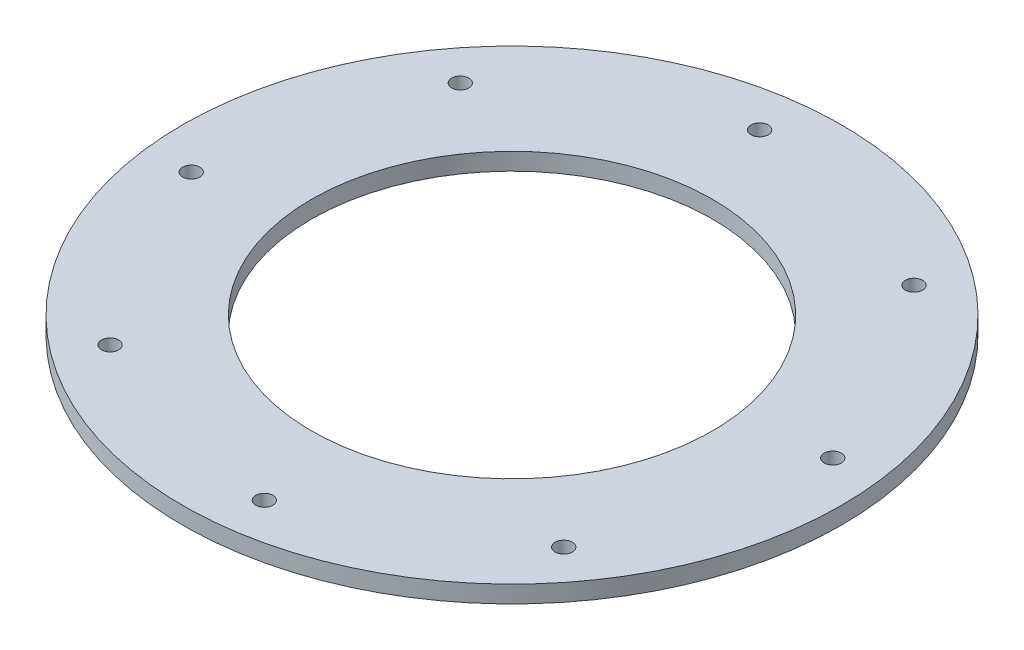
ISO-10303-21;
HEADER;
FILE_DESCRIPTION(('STEP AP214'),'2;1');
FILE_NAME('part.step','',(''),(''),'','','');
FILE_SCHEMA(('AUTOMOTIVE_DESIGN { 1 0 10303 214 1 1 1 1 }'));
ENDSEC;
DATA;
#1=APPLICATION_CONTEXT('core data for automotive mechanical design processes');
#2=APPLICATION_PROTOCOL_DEFINITION('international standard','automotive_design',2000,#1);
#3=PRODUCT_CONTEXT('',#1,'mechanical');
#4=PRODUCT('Part','Part','',(#3));
#5=PRODUCT_RELATED_PRODUCT_CATEGORY('part','',(#4));
#6=PRODUCT_DEFINITION_FORMATION('','',#4);
#7=PRODUCT_DEFINITION_CONTEXT('part definition',#1,'design');
#8=PRODUCT_DEFINITION('design','',#6,#7);
#9=PRODUCT_DEFINITION_SHAPE('','',#8);
#10=(LENGTH_UNIT() NAMED_UNIT(*) SI_UNIT(.MILLI.,.METRE.));
#11=(NAMED_UNIT(*) PLANE_ANGLE_UNIT() SI_UNIT($,.RADIAN.));
#12=(NAMED_UNIT(*) SI_UNIT($,.STERADIAN.) SOLID_ANGLE_UNIT());
#13=UNCERTAINTY_MEASURE_WITH_UNIT(LENGTH_MEASURE(1.E-05),#10,'distance_accuracy_value','');
#14=(GEOMETRIC_REPRESENTATION_CONTEXT(3) GLOBAL_UNCERTAINTY_ASSIGNED_CONTEXT((#13)) GLOBAL_UNIT_ASSIGNED_CONTEXT((#10,
#11,#12)) REPRESENTATION_CONTEXT('',''));
#15=CARTESIAN_POINT('',(0.,0.,0.));
#16=DIRECTION('',(0.,0.,1.));
#17=DIRECTION('',(1.,0.,0.));
#18=AXIS2_PLACEMENT_3D('',#15,#16,#17);
#19=CARTESIAN_POINT('',(1.02379162746304E-13,-92.,-2.68652454422299E-13));
#20=DIRECTION('',(0.,1.,0.));
#21=DIRECTION('',(0.991821591033947,0.,-0.127632016198486));
#22=AXIS2_PLACEMENT_3D('',#19,#20,#21);
#23=PLANE('',#22);
#24=CARTESIAN_POINT('',(30.5537154298437,-92.0000000000001,-39.5786618448899));
#25=DIRECTION('',(0.,-1.,0.));
#26=DIRECTION('',(-0.991821591033947,0.,0.127632016198486));
#27=AXIS2_PLACEMENT_3D('',#24,#25,#26);
#28=CIRCLE('',#27,1.50000000000008);
#29=CARTESIAN_POINT('',(29.0659830432927,-92.0000000000001,-39.3872138205922));
#30=VERTEX_POINT('',#29);
#31=EDGE_CURVE('E68',#30,#30,#28,.T.);
#32=ORIENTED_EDGE('',*,*,#31,.T.);
#33=EDGE_LOOP('',(#32));
#34=FACE_BOUND('',#33,.T.);
#35=CARTESIAN_POINT('',(-6.38160080992419,-92.0000000000001,-49.5910795516975));
#36=DIRECTION('',(0.,-1.,0.));
#37=DIRECTION('',(-0.991821591033947,0.,0.127632016198486));
#38=AXIS2_PLACEMENT_3D('',#35,#36,#37);
#39=CIRCLE('',#38,1.50000000000017);
#40=CARTESIAN_POINT('',(-7.86933319647529,-92.0000000000001,-49.3996315273997));
#41=VERTEX_POINT('',#40);
#42=EDGE_CURVE('E114',#41,#41,#39,.T.);
#43=ORIENTED_EDGE('',*,*,#42,.T.);
#44=EDGE_LOOP('',(#43));
#45=FACE_BOUND('',#44,.T.);
#46=CARTESIAN_POINT('',(-39.5786618448896,-92.,-30.5537154298439));
#47=DIRECTION('',(0.,-1.,0.));
#48=DIRECTION('',(-0.991821591033947,0.,0.127632016198486));
#49=AXIS2_PLACEMENT_3D('',#46,#47,#48);
#50=CIRCLE('',#49,1.50000000000027);
#51=CARTESIAN_POINT('',(-41.0663942314407,-92.,-30.3622674055461));
#52=VERTEX_POINT('',#51);
#53=EDGE_CURVE('E111',#52,#52,#50,.T.);
#54=ORIENTED_EDGE('',*,*,#53,.T.);
#55=EDGE_LOOP('',(#54));
#56=FACE_BOUND('',#55,.T.);
#57=CARTESIAN_POINT('',(-49.5910795516971,-92.,6.38160080992402));
#58=DIRECTION('',(0.,-1.,0.));
#59=DIRECTION('',(-0.991821591033947,0.,0.127632016198486));
#60=AXIS2_PLACEMENT_3D('',#57,#58,#59);
#61=CIRCLE('',#60,1.50000000000035);
#62=CARTESIAN_POINT('',(-51.0788119382484,-92.,6.5730488342218));
#63=VERTEX_POINT('',#62);
#64=EDGE_CURVE('E108',#63,#63,#61,.T.);
#65=ORIENTED_EDGE('',*,*,#64,.T.);
#66=EDGE_LOOP('',(#65));
#67=FACE_BOUND('',#66,.T.);
#68=CARTESIAN_POINT('',(-30.5537154298435,-92.,39.5786618448894));
#69=DIRECTION('',(0.,-1.,0.));
#70=DIRECTION('',(-0.991821591033947,0.,0.127632016198486));
#71=AXIS2_PLACEMENT_3D('',#68,#69,#70);
#72=CIRCLE('',#71,1.50000000000043);
#73=CARTESIAN_POINT('',(-32.0414478163949,-92.,39.7701098691872));
#74=VERTEX_POINT('',#73);
#75=EDGE_CURVE('E105',#74,#74,#72,.T.);
#76=ORIENTED_EDGE('',*,*,#75,.T.);
#77=EDGE_LOOP('',(#76));
#78=FACE_BOUND('',#77,.T.);
#79=CARTESIAN_POINT('',(6.38160080992439,-92.,49.591079551697));
#80=DIRECTION('',(0.,-1.,0.));
#81=DIRECTION('',(-0.991821591033947,0.,0.127632016198486));
#82=AXIS2_PLACEMENT_3D('',#79,#80,#81);
#83=CIRCLE('',#82,1.50000000000051);
#84=CARTESIAN_POINT('',(4.89386842337296,-92.,49.7825275759947));
#85=VERTEX_POINT('',#84);
#86=EDGE_CURVE('E102',#85,#85,#83,.T.);
#87=ORIENTED_EDGE('',*,*,#86,.T.);
#88=EDGE_LOOP('',(#87));
#89=FACE_BOUND('',#88,.T.);
#90=CARTESIAN_POINT('',(39.5786618448898,-92.,30.5537154298433));
#91=DIRECTION('',(0.,-1.,0.));
#92=DIRECTION('',(-0.991821591033947,0.,0.127632016198486));
#93=AXIS2_PLACEMENT_3D('',#90,#91,#92);
#94=CIRCLE('',#93,1.50000000000059);
#95=CARTESIAN_POINT('',(38.0909294583383,-92.,30.7451634541411));
#96=VERTEX_POINT('',#95);
#97=EDGE_CURVE('E99',#96,#96,#94,.T.);
#98=ORIENTED_EDGE('',*,*,#97,.T.);
#99=EDGE_LOOP('',(#98));
#100=FACE_BOUND('',#99,.T.);
#101=CARTESIAN_POINT('',(49.5910795516973,-92.0000000000001,-6.38160080992457));
#102=DIRECTION('',(0.,-1.,0.));
#103=DIRECTION('',(-0.991821591033947,0.,0.127632016198486));
#104=AXIS2_PLACEMENT_3D('',#101,#102,#103);
#105=CIRCLE('',#104,1.5);
#106=CARTESIAN_POINT('',(48.1033471651464,-92.0000000000001,-6.19015278562684));
#107=VERTEX_POINT('',#106);
#108=EDGE_CURVE('E96',#107,#107,#105,.T.);
#109=ORIENTED_EDGE('',*,*,#108,.T.);
#110=EDGE_LOOP('',(#109));
#111=FACE_BOUND('',#110,.T.);
#112=CARTESIAN_POINT('',(1.02379162746304E-13,-92.,-2.68652454422299E-13));
#113=DIRECTION('',(0.,1.,0.));
#114=DIRECTION('',(0.991821591033947,0.,-0.127632016198486));
#115=AXIS2_PLACEMENT_3D('',#112,#113,#114);
#116=CIRCLE('',#115,57.5);
#117=CARTESIAN_POINT('',(57.029741484452,-92.0000000000001,-7.33884093141323));
#118=VERTEX_POINT('',#117);
#119=EDGE_CURVE('E10',#118,#118,#116,.T.);
#120=ORIENTED_EDGE('',*,*,#119,.T.);
#121=EDGE_LOOP('',(#120));
#122=FACE_BOUND('',#121,.T.);
#123=CARTESIAN_POINT('',(1.02379162746304E-13,-92.,-2.68652454422299E-13));
#124=DIRECTION('',(0.,1.,0.));
#125=DIRECTION('',(0.991821591033947,0.,-0.127632016198486));
#126=AXIS2_PLACEMENT_3D('',#123,#124,#125);
#127=CIRCLE('',#126,35.);
#128=CARTESIAN_POINT('',(34.7137556861882,-92.0000000000001,-4.46712056694729));
#129=VERTEX_POINT('',#128);
#130=EDGE_CURVE('E58',#129,#129,#127,.T.);
#131=ORIENTED_EDGE('',*,*,#130,.F.);
#132=EDGE_LOOP('',(#131));
#133=FACE_BOUND('',#132,.T.);
#134=ADVANCED_FACE('F40',(#34,#45,#56,#67,#78,#89,#100,#111,#122,#133),#23,.T.);
#135=CARTESIAN_POINT('',(0.,-95.,-2.65429199837879E-13));
#136=DIRECTION('',(0.,1.,0.));
#137=DIRECTION('',(0.991821591033947,0.,-0.127632016198486));
#138=AXIS2_PLACEMENT_3D('',#135,#136,#137);
#139=PLANE('',#138);
#140=CARTESIAN_POINT('',(30.5537154298437,-95.0000000000001,-39.5786618448899));
#141=DIRECTION('',(0.,1.,0.));
#142=DIRECTION('',(0.991821591033947,0.,-0.127632016198486));
#143=AXIS2_PLACEMENT_3D('',#140,#141,#142);
#144=CIRCLE('',#143,1.50000000000008);
#145=CARTESIAN_POINT('',(32.0414478163947,-95.0000000000001,-39.7701098691877));
#146=VERTEX_POINT('',#145);
#147=EDGE_CURVE('E44',#146,#146,#144,.T.);
#148=ORIENTED_EDGE('',*,*,#147,.T.);
#149=EDGE_LOOP('',(#148));
#150=FACE_BOUND('',#149,.T.);
#151=CARTESIAN_POINT('',(-6.3816008099242,-95.0000000000001,-49.5910795516975));
#152=DIRECTION('',(0.,1.,0.));
#153=DIRECTION('',(0.991821591033947,0.,-0.127632016198486));
#154=AXIS2_PLACEMENT_3D('',#151,#152,#153);
#155=CIRCLE('',#154,1.50000000000017);
#156=CARTESIAN_POINT('',(-4.8938684233731,-95.0000000000001,-49.7825275759952));
#157=VERTEX_POINT('',#156);
#158=EDGE_CURVE('E82',#157,#157,#155,.T.);
#159=ORIENTED_EDGE('',*,*,#158,.T.);
#160=EDGE_LOOP('',(#159));
#161=FACE_BOUND('',#160,.T.);
#162=CARTESIAN_POINT('',(-39.5786618448896,-95.,-30.5537154298439));
#163=DIRECTION('',(0.,1.,0.));
#164=DIRECTION('',(0.991821591033947,0.,-0.127632016198486));
#165=AXIS2_PLACEMENT_3D('',#162,#163,#164);
#166=CIRCLE('',#165,1.50000000000027);
#167=CARTESIAN_POINT('',(-38.0909294583384,-95.,-30.7451634541416));
#168=VERTEX_POINT('',#167);
#169=EDGE_CURVE('E80',#168,#168,#166,.T.);
#170=ORIENTED_EDGE('',*,*,#169,.T.);
#171=EDGE_LOOP('',(#170));
#172=FACE_BOUND('',#171,.T.);
#173=CARTESIAN_POINT('',(-49.5910795516971,-95.,6.38160080992403));
#174=DIRECTION('',(0.,1.,0.));
#175=DIRECTION('',(0.991821591033947,0.,-0.127632016198486));
#176=AXIS2_PLACEMENT_3D('',#173,#174,#175);
#177=CIRCLE('',#176,1.50000000000035);
#178=CARTESIAN_POINT('',(-48.1033471651459,-95.,6.19015278562625));
#179=VERTEX_POINT('',#178);
#180=EDGE_CURVE('E77',#179,#179,#177,.T.);
#181=ORIENTED_EDGE('',*,*,#180,.T.);
#182=EDGE_LOOP('',(#181));
#183=FACE_BOUND('',#182,.T.);
#184=CARTESIAN_POINT('',(-30.5537154298435,-95.,39.5786618448894));
#185=DIRECTION('',(0.,1.,0.));
#186=DIRECTION('',(0.991821591033947,0.,-0.127632016198486));
#187=AXIS2_PLACEMENT_3D('',#184,#185,#186);
#188=CIRCLE('',#187,1.50000000000043);
#189=CARTESIAN_POINT('',(-29.0659830432922,-95.,39.3872138205916));
#190=VERTEX_POINT('',#189);
#191=EDGE_CURVE('E74',#190,#190,#188,.T.);
#192=ORIENTED_EDGE('',*,*,#191,.T.);
#193=EDGE_LOOP('',(#192));
#194=FACE_BOUND('',#193,.T.);
#195=CARTESIAN_POINT('',(6.38160080992439,-95.,49.591079551697));
#196=DIRECTION('',(0.,1.,0.));
#197=DIRECTION('',(0.991821591033947,0.,-0.127632016198486));
#198=AXIS2_PLACEMENT_3D('',#195,#196,#197);
#199=CIRCLE('',#198,1.50000000000051);
#200=CARTESIAN_POINT('',(7.86933319647582,-95.,49.3996315273992));
#201=VERTEX_POINT('',#200);
#202=EDGE_CURVE('E71',#201,#201,#199,.T.);
#203=ORIENTED_EDGE('',*,*,#202,.T.);
#204=EDGE_LOOP('',(#203));
#205=FACE_BOUND('',#204,.T.);
#206=CARTESIAN_POINT('',(39.5786618448898,-95.,30.5537154298433));
#207=DIRECTION('',(0.,1.,0.));
#208=DIRECTION('',(0.991821591033947,0.,-0.127632016198486));
#209=AXIS2_PLACEMENT_3D('',#206,#207,#208);
#210=CIRCLE('',#209,1.50000000000059);
#211=CARTESIAN_POINT('',(41.0663942314413,-95.,30.3622674055455));
#212=VERTEX_POINT('',#211);
#213=EDGE_CURVE('E67',#212,#212,#210,.T.);
#214=ORIENTED_EDGE('',*,*,#213,.T.);
#215=EDGE_LOOP('',(#214));
#216=FACE_BOUND('',#215,.T.);
#217=CARTESIAN_POINT('',(49.5910795516973,-95.0000000000001,-6.38160080992457));
#218=DIRECTION('',(0.,1.,0.));
#219=DIRECTION('',(0.991821591033947,0.,-0.127632016198486));
#220=AXIS2_PLACEMENT_3D('',#217,#218,#219);
#221=CIRCLE('',#220,1.5);
#222=CARTESIAN_POINT('',(51.0788119382482,-95.0000000000001,-6.57304883422229));
#223=VERTEX_POINT('',#222);
#224=EDGE_CURVE('E64',#223,#223,#221,.T.);
#225=ORIENTED_EDGE('',*,*,#224,.T.);
#226=EDGE_LOOP('',(#225));
#227=FACE_BOUND('',#226,.T.);
#228=CARTESIAN_POINT('',(0.,-95.,-2.65429199837879E-13));
#229=DIRECTION('',(0.,1.,0.));
#230=DIRECTION('',(0.991821591033947,0.,-0.127632016198486));
#231=AXIS2_PLACEMENT_3D('',#228,#229,#230);
#232=CIRCLE('',#231,57.5);
#233=CARTESIAN_POINT('',(57.029741484452,-95.0000000000001,-7.33884093141323));
#234=VERTEX_POINT('',#233);
#235=EDGE_CURVE('E49',#234,#234,#232,.T.);
#236=ORIENTED_EDGE('',*,*,#235,.F.);
#237=EDGE_LOOP('',(#236));
#238=FACE_BOUND('',#237,.T.);
#239=CARTESIAN_POINT('',(0.,-95.,-2.65429199837879E-13));
#240=DIRECTION('',(0.,1.,0.));
#241=DIRECTION('',(0.991821591033947,0.,-0.127632016198486));
#242=AXIS2_PLACEMENT_3D('',#239,#240,#241);
#243=CIRCLE('',#242,35.);
#244=CARTESIAN_POINT('',(34.7137556861882,-95.0000000000001,-4.46712056694729));
#245=VERTEX_POINT('',#244);
#246=EDGE_CURVE('E61',#245,#245,#243,.T.);
#247=ORIENTED_EDGE('',*,*,#246,.T.);
#248=EDGE_LOOP('',(#247));
#249=FACE_BOUND('',#248,.T.);
#250=ADVANCED_FACE('F134',(#150,#161,#172,#183,#194,#205,#216,#227,#238,#249),#139,.F.);
#251=CARTESIAN_POINT('',(1.02379162746304E-13,-92.,-2.68652454422299E-13));
#252=DIRECTION('',(0.,-1.,0.));
#253=DIRECTION('',(-0.991821591033947,0.,0.127632016198486));
#254=AXIS2_PLACEMENT_3D('',#251,#252,#253);
#255=CYLINDRICAL_SURFACE('',#254,57.5);
#256=ORIENTED_EDGE('',*,*,#119,.F.);
#257=EDGE_LOOP('',(#256));
#258=FACE_BOUND('',#257,.T.);
#259=ORIENTED_EDGE('',*,*,#235,.T.);
#260=EDGE_LOOP('',(#259));
#261=FACE_BOUND('',#260,.T.);
#262=ADVANCED_FACE('F42',(#258,#261),#255,.T.);
#263=CARTESIAN_POINT('',(1.02379162746304E-13,-92.,-2.68652454422299E-13));
#264=DIRECTION('',(0.,-1.,0.));
#265=DIRECTION('',(-0.991821591033947,0.,0.127632016198486));
#266=AXIS2_PLACEMENT_3D('',#263,#264,#265);
#267=CYLINDRICAL_SURFACE('',#266,35.);
#268=ORIENTED_EDGE('',*,*,#130,.T.);
#269=EDGE_LOOP('',(#268));
#270=FACE_BOUND('',#269,.T.);
#271=ORIENTED_EDGE('',*,*,#246,.F.);
#272=EDGE_LOOP('',(#271));
#273=FACE_BOUND('',#272,.T.);
#274=ADVANCED_FACE('F140',(#270,#273),#267,.F.);
#275=CARTESIAN_POINT('',(49.5910795516973,-92.0000000000001,-6.38160080992457));
#276=DIRECTION('',(0.,-1.,0.));
#277=DIRECTION('',(-0.991821591033947,0.,0.127632016198486));
#278=AXIS2_PLACEMENT_3D('',#275,#276,#277);
#279=CYLINDRICAL_SURFACE('',#278,1.5);
#280=ORIENTED_EDGE('',*,*,#108,.F.);
#281=EDGE_LOOP('',(#280));
#282=FACE_BOUND('',#281,.T.);
#283=ORIENTED_EDGE('',*,*,#224,.F.);
#284=EDGE_LOOP('',(#283));
#285=FACE_BOUND('',#284,.T.);
#286=ADVANCED_FACE('F143',(#282,#285),#279,.F.);
#287=CARTESIAN_POINT('',(39.5786618448898,-92.,30.5537154298433));
#288=DIRECTION('',(0.,-1.,0.));
#289=DIRECTION('',(-0.991821591033947,0.,0.127632016198486));
#290=AXIS2_PLACEMENT_3D('',#287,#288,#289);
#291=CYLINDRICAL_SURFACE('',#290,1.50000000000059);
#292=ORIENTED_EDGE('',*,*,#97,.F.);
#293=EDGE_LOOP('',(#292));
#294=FACE_BOUND('',#293,.T.);
#295=ORIENTED_EDGE('',*,*,#213,.F.);
#296=EDGE_LOOP('',(#295));
#297=FACE_BOUND('',#296,.T.);
#298=ADVANCED_FACE('F146',(#294,#297),#291,.F.);
#299=CARTESIAN_POINT('',(6.38160080992439,-92.,49.591079551697));
#300=DIRECTION('',(0.,-1.,0.));
#301=DIRECTION('',(-0.991821591033947,0.,0.127632016198486));
#302=AXIS2_PLACEMENT_3D('',#299,#300,#301);
#303=CYLINDRICAL_SURFACE('',#302,1.50000000000051);
#304=ORIENTED_EDGE('',*,*,#86,.F.);
#305=EDGE_LOOP('',(#304));
#306=FACE_BOUND('',#305,.T.);
#307=ORIENTED_EDGE('',*,*,#202,.F.);
#308=EDGE_LOOP('',(#307));
#309=FACE_BOUND('',#308,.T.);
#310=ADVANCED_FACE('F150',(#306,#309),#303,.F.);
#311=CARTESIAN_POINT('',(-30.5537154298435,-92.,39.5786618448894));
#312=DIRECTION('',(0.,-1.,0.));
#313=DIRECTION('',(-0.991821591033947,0.,0.127632016198486));
#314=AXIS2_PLACEMENT_3D('',#311,#312,#313);
#315=CYLINDRICAL_SURFACE('',#314,1.50000000000043);
#316=ORIENTED_EDGE('',*,*,#75,.F.);
#317=EDGE_LOOP('',(#316));
#318=FACE_BOUND('',#317,.T.);
#319=ORIENTED_EDGE('',*,*,#191,.F.);
#320=EDGE_LOOP('',(#319));
#321=FACE_BOUND('',#320,.T.);
#322=ADVANCED_FACE('F154',(#318,#321),#315,.F.);
#323=CARTESIAN_POINT('',(-49.5910795516971,-92.,6.38160080992402));
#324=DIRECTION('',(0.,-1.,0.));
#325=DIRECTION('',(-0.991821591033947,0.,0.127632016198486));
#326=AXIS2_PLACEMENT_3D('',#323,#324,#325);
#327=CYLINDRICAL_SURFACE('',#326,1.50000000000035);
#328=ORIENTED_EDGE('',*,*,#64,.F.);
#329=EDGE_LOOP('',(#328));
#330=FACE_BOUND('',#329,.T.);
#331=ORIENTED_EDGE('',*,*,#180,.F.);
#332=EDGE_LOOP('',(#331));
#333=FACE_BOUND('',#332,.T.);
#334=ADVANCED_FACE('F158',(#330,#333),#327,.F.);
#335=CARTESIAN_POINT('',(-39.5786618448896,-92.,-30.5537154298439));
#336=DIRECTION('',(0.,-1.,0.));
#337=DIRECTION('',(-0.991821591033947,0.,0.127632016198486));
#338=AXIS2_PLACEMENT_3D('',#335,#336,#337);
#339=CYLINDRICAL_SURFACE('',#338,1.50000000000027);
#340=ORIENTED_EDGE('',*,*,#53,.F.);
#341=EDGE_LOOP('',(#340));
#342=FACE_BOUND('',#341,.T.);
#343=ORIENTED_EDGE('',*,*,#169,.F.);
#344=EDGE_LOOP('',(#343));
#345=FACE_BOUND('',#344,.T.);
#346=ADVANCED_FACE('F130',(#342,#345),#339,.F.);
#347=CARTESIAN_POINT('',(-6.38160080992419,-92.0000000000001,-49.5910795516975));
#348=DIRECTION('',(0.,-1.,0.));
#349=DIRECTION('',(-0.991821591033947,0.,0.127632016198486));
#350=AXIS2_PLACEMENT_3D('',#347,#348,#349);
#351=CYLINDRICAL_SURFACE('',#350,1.50000000000017);
#352=ORIENTED_EDGE('',*,*,#42,.F.);
#353=EDGE_LOOP('',(#352));
#354=FACE_BOUND('',#353,.T.);
#355=ORIENTED_EDGE('',*,*,#158,.F.);
#356=EDGE_LOOP('',(#355));
#357=FACE_BOUND('',#356,.T.);
#358=ADVANCED_FACE('F125',(#354,#357),#351,.F.);
#359=CARTESIAN_POINT('',(30.5537154298437,-92.0000000000001,-39.5786618448899));
#360=DIRECTION('',(0.,-1.,0.));
#361=DIRECTION('',(-0.991821591033947,0.,0.127632016198486));
#362=AXIS2_PLACEMENT_3D('',#359,#360,#361);
#363=CYLINDRICAL_SURFACE('',#362,1.50000000000008);
#364=ORIENTED_EDGE('',*,*,#31,.F.);
#365=EDGE_LOOP('',(#364));
#366=FACE_BOUND('',#365,.T.);
#367=ORIENTED_EDGE('',*,*,#147,.F.);
#368=EDGE_LOOP('',(#367));
#369=FACE_BOUND('',#368,.T.);
#370=ADVANCED_FACE('F122',(#366,#369),#363,.F.);
#371=CLOSED_SHELL('',(#134,#250,#262,#274,#286,#298,#310,#322,#334,#346,#358,#370));
#372=MANIFOLD_SOLID_BREP('B2',#371);
#373=ADVANCED_BREP_SHAPE_REPRESENTATION('',(#18,#372),#14);
#374=SHAPE_DEFINITION_REPRESENTATION(#9,#373);
ENDSEC;
END-ISO-10303-21;
